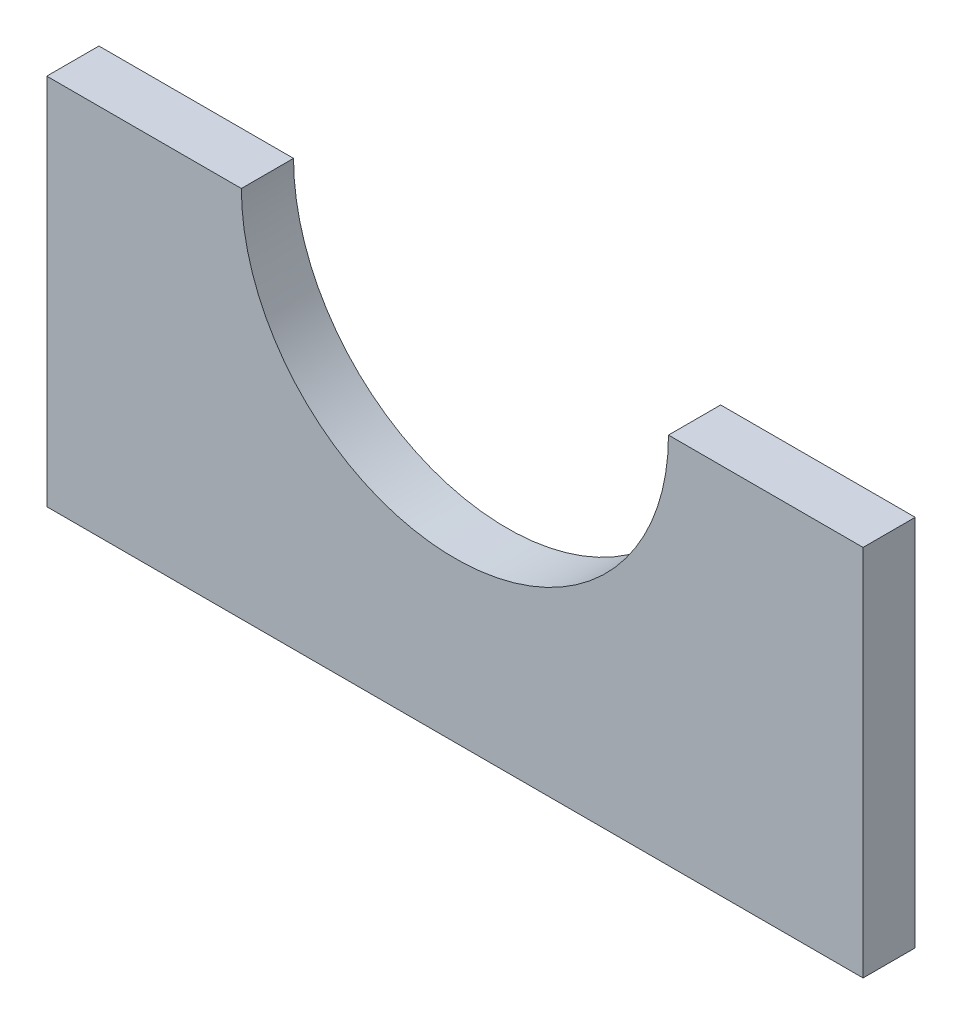
ISO-10303-21;
HEADER;
FILE_DESCRIPTION(('STEP AP214'),'2;1');
FILE_NAME('part.step','',(''),(''),'','','');
FILE_SCHEMA(('AUTOMOTIVE_DESIGN { 1 0 10303 214 1 1 1 1 }'));
ENDSEC;
DATA;
#1=APPLICATION_CONTEXT('core data for automotive mechanical design processes');
#2=APPLICATION_PROTOCOL_DEFINITION('international standard','automotive_design',2000,#1);
#3=PRODUCT_CONTEXT('',#1,'mechanical');
#4=PRODUCT('Part','Part','',(#3));
#5=PRODUCT_RELATED_PRODUCT_CATEGORY('part','',(#4));
#6=PRODUCT_DEFINITION_FORMATION('','',#4);
#7=PRODUCT_DEFINITION_CONTEXT('part definition',#1,'design');
#8=PRODUCT_DEFINITION('design','',#6,#7);
#9=PRODUCT_DEFINITION_SHAPE('','',#8);
#10=(LENGTH_UNIT() NAMED_UNIT(*) SI_UNIT(.MILLI.,.METRE.));
#11=(NAMED_UNIT(*) PLANE_ANGLE_UNIT() SI_UNIT($,.RADIAN.));
#12=(NAMED_UNIT(*) SI_UNIT($,.STERADIAN.) SOLID_ANGLE_UNIT());
#13=UNCERTAINTY_MEASURE_WITH_UNIT(LENGTH_MEASURE(1.E-05),#10,'distance_accuracy_value','');
#14=(GEOMETRIC_REPRESENTATION_CONTEXT(3) GLOBAL_UNCERTAINTY_ASSIGNED_CONTEXT((#13)) GLOBAL_UNIT_ASSIGNED_CONTEXT((#10,
#11,#12)) REPRESENTATION_CONTEXT('',''));
#15=CARTESIAN_POINT('',(0.,0.,0.));
#16=DIRECTION('',(0.,0.,1.));
#17=DIRECTION('',(1.,0.,0.));
#18=AXIS2_PLACEMENT_3D('',#15,#16,#17);
#19=CARTESIAN_POINT('',(0.,12.7,0.));
#20=DIRECTION('',(0.,1.,0.));
#21=DIRECTION('',(0.,0.,1.));
#22=AXIS2_PLACEMENT_3D('',#19,#20,#21);
#23=PLANE('',#22);
#24=DIRECTION('',(0.,0.,1.));
#25=VECTOR('',#24,1.);
#26=CARTESIAN_POINT('',(-13.,12.7,-1.5875));
#27=LINE('',#26,#25);
#28=CARTESIAN_POINT('',(-13.,12.7,-1.5875));
#29=VERTEX_POINT('',#28);
#30=CARTESIAN_POINT('',(-13.,12.7,1.5875));
#31=VERTEX_POINT('',#30);
#32=EDGE_CURVE('E123',#29,#31,#27,.T.);
#33=ORIENTED_EDGE('',*,*,#32,.F.);
#34=DIRECTION('',(-1.,0.,0.));
#35=VECTOR('',#34,1.);
#36=CARTESIAN_POINT('',(-19.845,12.7,-1.5875));
#37=LINE('',#36,#35);
#38=CARTESIAN_POINT('',(-24.845,12.7,-1.5875));
#39=VERTEX_POINT('',#38);
#40=EDGE_CURVE('E136',#29,#39,#37,.T.);
#41=ORIENTED_EDGE('',*,*,#40,.T.);
#42=DIRECTION('',(0.,0.,1.));
#43=VECTOR('',#42,1.);
#44=CARTESIAN_POINT('',(-24.845,12.7,-1.5875));
#45=LINE('',#44,#43);
#46=CARTESIAN_POINT('',(-24.845,12.7,1.5875));
#47=VERTEX_POINT('',#46);
#48=EDGE_CURVE('E100',#39,#47,#45,.T.);
#49=ORIENTED_EDGE('',*,*,#48,.T.);
#50=DIRECTION('',(1.,0.,0.));
#51=VECTOR('',#50,1.);
#52=CARTESIAN_POINT('',(-19.845,12.7,1.5875));
#53=LINE('',#52,#51);
#54=EDGE_CURVE('E11',#47,#31,#53,.T.);
#55=ORIENTED_EDGE('',*,*,#54,.T.);
#56=EDGE_LOOP('',(#33,#41,#49,#55));
#57=FACE_BOUND('',#56,.T.);
#58=ADVANCED_FACE('F38',(#57),#23,.T.);
#59=CARTESIAN_POINT('',(-19.845,12.7,-1.5875));
#60=DIRECTION('',(0.,0.,1.));
#61=DIRECTION('',(1.,0.,0.));
#62=AXIS2_PLACEMENT_3D('',#59,#60,#61);
#63=PLANE('',#62);
#64=ORIENTED_EDGE('',*,*,#40,.F.);
#65=CARTESIAN_POINT('',(0.,12.7,-1.5875));
#66=DIRECTION('',(0.,0.,1.));
#67=DIRECTION('',(1.,0.,0.));
#68=AXIS2_PLACEMENT_3D('',#65,#66,#67);
#69=CIRCLE('',#68,13.);
#70=CARTESIAN_POINT('',(13.,12.7,-1.5875));
#71=VERTEX_POINT('',#70);
#72=EDGE_CURVE('E121',#29,#71,#69,.T.);
#73=ORIENTED_EDGE('',*,*,#72,.T.);
#74=CARTESIAN_POINT('',(24.845,12.7,-1.5875));
#75=VERTEX_POINT('',#74);
#76=EDGE_CURVE('E61',#75,#71,#37,.T.);
#77=ORIENTED_EDGE('',*,*,#76,.F.);
#78=DIRECTION('',(0.,1.,0.));
#79=VECTOR('',#78,1.);
#80=CARTESIAN_POINT('',(24.845,12.7,-1.5875));
#81=LINE('',#80,#79);
#82=CARTESIAN_POINT('',(24.845,-10.,-1.5875));
#83=VERTEX_POINT('',#82);
#84=EDGE_CURVE('E115',#83,#75,#81,.T.);
#85=ORIENTED_EDGE('',*,*,#84,.F.);
#86=DIRECTION('',(1.,0.,0.));
#87=VECTOR('',#86,1.);
#88=CARTESIAN_POINT('',(-24.845,-10.,-1.5875));
#89=LINE('',#88,#87);
#90=CARTESIAN_POINT('',(-24.845,-10.,-1.5875));
#91=VERTEX_POINT('',#90);
#92=EDGE_CURVE('E109',#91,#83,#89,.T.);
#93=ORIENTED_EDGE('',*,*,#92,.F.);
#94=DIRECTION('',(0.,-1.,0.));
#95=VECTOR('',#94,1.);
#96=CARTESIAN_POINT('',(-24.845,12.7,-1.5875));
#97=LINE('',#96,#95);
#98=EDGE_CURVE('E93',#39,#91,#97,.T.);
#99=ORIENTED_EDGE('',*,*,#98,.F.);
#100=EDGE_LOOP('',(#64,#73,#77,#85,#93,#99));
#101=FACE_BOUND('',#100,.T.);
#102=ADVANCED_FACE('F40',(#101),#63,.F.);
#103=CARTESIAN_POINT('',(-19.845,12.7,1.5875));
#104=DIRECTION('',(0.,0.,-1.));
#105=DIRECTION('',(-1.,0.,0.));
#106=AXIS2_PLACEMENT_3D('',#103,#104,#105);
#107=PLANE('',#106);
#108=CARTESIAN_POINT('',(13.,12.7,1.5875));
#109=VERTEX_POINT('',#108);
#110=CARTESIAN_POINT('',(24.845,12.7,1.5875));
#111=VERTEX_POINT('',#110);
#112=EDGE_CURVE('E46',#109,#111,#53,.T.);
#113=ORIENTED_EDGE('',*,*,#112,.F.);
#114=CARTESIAN_POINT('',(0.,12.7,1.5875));
#115=DIRECTION('',(0.,0.,1.));
#116=DIRECTION('',(1.,0.,0.));
#117=AXIS2_PLACEMENT_3D('',#114,#115,#116);
#118=CIRCLE('',#117,13.);
#119=EDGE_CURVE('E53',#31,#109,#118,.T.);
#120=ORIENTED_EDGE('',*,*,#119,.F.);
#121=ORIENTED_EDGE('',*,*,#54,.F.);
#122=DIRECTION('',(0.,-1.,0.));
#123=VECTOR('',#122,1.);
#124=CARTESIAN_POINT('',(-24.845,12.7,1.5875));
#125=LINE('',#124,#123);
#126=CARTESIAN_POINT('',(-24.845,-10.,1.5875));
#127=VERTEX_POINT('',#126);
#128=EDGE_CURVE('E103',#47,#127,#125,.T.);
#129=ORIENTED_EDGE('',*,*,#128,.T.);
#130=DIRECTION('',(1.,0.,0.));
#131=VECTOR('',#130,1.);
#132=CARTESIAN_POINT('',(-24.845,-10.,1.5875));
#133=LINE('',#132,#131);
#134=CARTESIAN_POINT('',(24.845,-10.,1.5875));
#135=VERTEX_POINT('',#134);
#136=EDGE_CURVE('E111',#127,#135,#133,.T.);
#137=ORIENTED_EDGE('',*,*,#136,.T.);
#138=DIRECTION('',(0.,1.,0.));
#139=VECTOR('',#138,1.);
#140=CARTESIAN_POINT('',(24.845,12.7,1.5875));
#141=LINE('',#140,#139);
#142=EDGE_CURVE('E130',#135,#111,#141,.T.);
#143=ORIENTED_EDGE('',*,*,#142,.T.);
#144=EDGE_LOOP('',(#113,#120,#121,#129,#137,#143));
#145=FACE_BOUND('',#144,.T.);
#146=ADVANCED_FACE('F144',(#145),#107,.F.);
#147=DIRECTION('',(0.,0.,1.));
#148=VECTOR('',#147,1.);
#149=CARTESIAN_POINT('',(13.,12.7,-1.5875));
#150=LINE('',#149,#148);
#151=EDGE_CURVE('E125',#71,#109,#150,.T.);
#152=ORIENTED_EDGE('',*,*,#151,.T.);
#153=ORIENTED_EDGE('',*,*,#112,.T.);
#154=DIRECTION('',(0.,0.,1.));
#155=VECTOR('',#154,1.);
#156=CARTESIAN_POINT('',(24.845,12.7,-1.5875));
#157=LINE('',#156,#155);
#158=EDGE_CURVE('E134',#75,#111,#157,.T.);
#159=ORIENTED_EDGE('',*,*,#158,.F.);
#160=ORIENTED_EDGE('',*,*,#76,.T.);
#161=EDGE_LOOP('',(#152,#153,#159,#160));
#162=FACE_BOUND('',#161,.T.);
#163=ADVANCED_FACE('F142',(#162),#23,.T.);
#164=CARTESIAN_POINT('',(24.845,12.7,-1.5875));
#165=DIRECTION('',(1.,0.,0.));
#166=DIRECTION('',(0.,0.,-1.));
#167=AXIS2_PLACEMENT_3D('',#164,#165,#166);
#168=PLANE('',#167);
#169=ORIENTED_EDGE('',*,*,#158,.T.);
#170=ORIENTED_EDGE('',*,*,#142,.F.);
#171=DIRECTION('',(0.,0.,1.));
#172=VECTOR('',#171,1.);
#173=CARTESIAN_POINT('',(24.845,-10.,-1.5875));
#174=LINE('',#173,#172);
#175=EDGE_CURVE('E112',#83,#135,#174,.T.);
#176=ORIENTED_EDGE('',*,*,#175,.F.);
#177=ORIENTED_EDGE('',*,*,#84,.T.);
#178=EDGE_LOOP('',(#169,#170,#176,#177));
#179=FACE_BOUND('',#178,.T.);
#180=ADVANCED_FACE('F146',(#179),#168,.T.);
#181=CARTESIAN_POINT('',(-24.845,12.7,-1.5875));
#182=DIRECTION('',(-1.,0.,0.));
#183=DIRECTION('',(0.,0.,1.));
#184=AXIS2_PLACEMENT_3D('',#181,#182,#183);
#185=PLANE('',#184);
#186=ORIENTED_EDGE('',*,*,#98,.T.);
#187=DIRECTION('',(0.,0.,1.));
#188=VECTOR('',#187,1.);
#189=CARTESIAN_POINT('',(-24.845,-10.,-1.5875));
#190=LINE('',#189,#188);
#191=EDGE_CURVE('E97',#91,#127,#190,.T.);
#192=ORIENTED_EDGE('',*,*,#191,.T.);
#193=ORIENTED_EDGE('',*,*,#128,.F.);
#194=ORIENTED_EDGE('',*,*,#48,.F.);
#195=EDGE_LOOP('',(#186,#192,#193,#194));
#196=FACE_BOUND('',#195,.T.);
#197=ADVANCED_FACE('F95',(#196),#185,.T.);
#198=CARTESIAN_POINT('',(0.,12.7,-1.5875));
#199=DIRECTION('',(0.,0.,1.));
#200=DIRECTION('',(1.,0.,0.));
#201=AXIS2_PLACEMENT_3D('',#198,#199,#200);
#202=CYLINDRICAL_SURFACE('',#201,13.);
#203=ORIENTED_EDGE('',*,*,#119,.T.);
#204=ORIENTED_EDGE('',*,*,#151,.F.);
#205=ORIENTED_EDGE('',*,*,#72,.F.);
#206=ORIENTED_EDGE('',*,*,#32,.T.);
#207=EDGE_LOOP('',(#203,#204,#205,#206));
#208=FACE_BOUND('',#207,.T.);
#209=ADVANCED_FACE('F140',(#208),#202,.F.);
#210=CARTESIAN_POINT('',(-24.845,-10.,-1.5875));
#211=DIRECTION('',(0.,-1.,0.));
#212=DIRECTION('',(0.,0.,-1.));
#213=AXIS2_PLACEMENT_3D('',#210,#211,#212);
#214=PLANE('',#213);
#215=ORIENTED_EDGE('',*,*,#136,.F.);
#216=ORIENTED_EDGE('',*,*,#191,.F.);
#217=ORIENTED_EDGE('',*,*,#92,.T.);
#218=ORIENTED_EDGE('',*,*,#175,.T.);
#219=EDGE_LOOP('',(#215,#216,#217,#218));
#220=FACE_BOUND('',#219,.T.);
#221=ADVANCED_FACE('F107',(#220),#214,.T.);
#222=CLOSED_SHELL('',(#58,#102,#146,#163,#180,#197,#209,#221));
#223=MANIFOLD_SOLID_BREP('B2',#222);
#224=ADVANCED_BREP_SHAPE_REPRESENTATION('',(#18,#223),#14);
#225=SHAPE_DEFINITION_REPRESENTATION(#9,#224);
ENDSEC;
END-ISO-10303-21;
